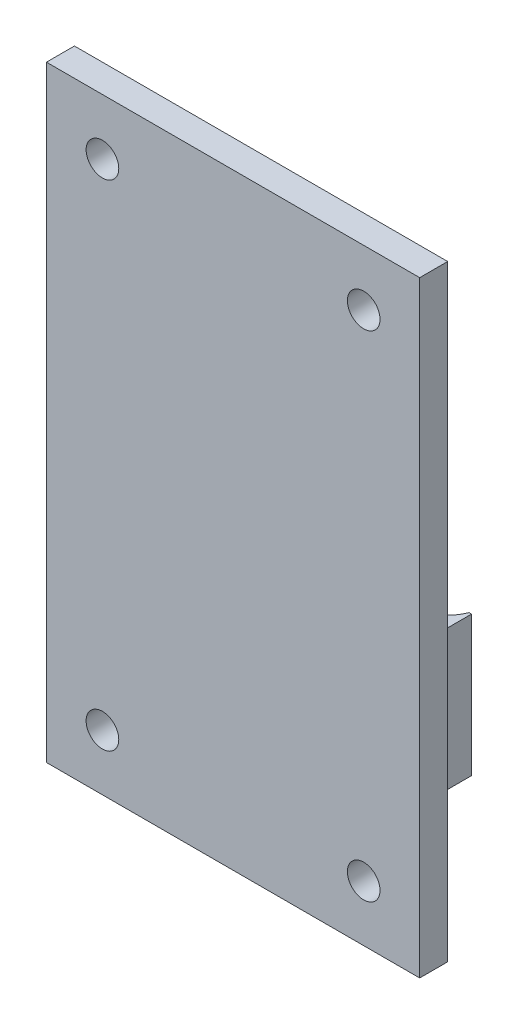
ISO-10303-21;
HEADER;
FILE_DESCRIPTION(('STEP AP214'),'2;1');
FILE_NAME('part.step','',(''),(''),'','','');
FILE_SCHEMA(('AUTOMOTIVE_DESIGN { 1 0 10303 214 1 1 1 1 }'));
ENDSEC;
DATA;
#1=APPLICATION_CONTEXT('core data for automotive mechanical design processes');
#2=APPLICATION_PROTOCOL_DEFINITION('international standard','automotive_design',2000,#1);
#3=PRODUCT_CONTEXT('',#1,'mechanical');
#4=PRODUCT('Part','Part','',(#3));
#5=PRODUCT_RELATED_PRODUCT_CATEGORY('part','',(#4));
#6=PRODUCT_DEFINITION_FORMATION('','',#4);
#7=PRODUCT_DEFINITION_CONTEXT('part definition',#1,'design');
#8=PRODUCT_DEFINITION('design','',#6,#7);
#9=PRODUCT_DEFINITION_SHAPE('','',#8);
#10=(LENGTH_UNIT() NAMED_UNIT(*) SI_UNIT(.MILLI.,.METRE.));
#11=(NAMED_UNIT(*) PLANE_ANGLE_UNIT() SI_UNIT($,.RADIAN.));
#12=(NAMED_UNIT(*) SI_UNIT($,.STERADIAN.) SOLID_ANGLE_UNIT());
#13=UNCERTAINTY_MEASURE_WITH_UNIT(LENGTH_MEASURE(1.E-05),#10,'distance_accuracy_value','');
#14=(GEOMETRIC_REPRESENTATION_CONTEXT(3) GLOBAL_UNCERTAINTY_ASSIGNED_CONTEXT((#13)) GLOBAL_UNIT_ASSIGNED_CONTEXT((#10,
#11,#12)) REPRESENTATION_CONTEXT('',''));
#15=CARTESIAN_POINT('',(0.,0.,0.));
#16=DIRECTION('',(0.,0.,1.));
#17=DIRECTION('',(1.,0.,0.));
#18=AXIS2_PLACEMENT_3D('',#15,#16,#17);
#19=CARTESIAN_POINT('',(0.,0.,3.));
#20=DIRECTION('',(0.,0.,-1.));
#21=DIRECTION('',(-1.,0.,0.));
#22=AXIS2_PLACEMENT_3D('',#19,#20,#21);
#23=PLANE('',#22);
#24=DIRECTION('',(0.,-1.,0.));
#25=VECTOR('',#24,1.);
#26=CARTESIAN_POINT('',(0.,0.,3.));
#27=LINE('',#26,#25);
#28=CARTESIAN_POINT('',(0.,65.,3.));
#29=VERTEX_POINT('',#28);
#30=CARTESIAN_POINT('',(0.,0.,3.));
#31=VERTEX_POINT('',#30);
#32=EDGE_CURVE('E181',#29,#31,#27,.T.);
#33=ORIENTED_EDGE('',*,*,#32,.T.);
#34=DIRECTION('',(1.,0.,0.));
#35=VECTOR('',#34,1.);
#36=CARTESIAN_POINT('',(0.,0.,3.));
#37=LINE('',#36,#35);
#38=CARTESIAN_POINT('',(40.,0.,3.));
#39=VERTEX_POINT('',#38);
#40=EDGE_CURVE('E87',#31,#39,#37,.T.);
#41=ORIENTED_EDGE('',*,*,#40,.T.);
#42=DIRECTION('',(0.,1.,0.));
#43=VECTOR('',#42,1.);
#44=CARTESIAN_POINT('',(40.,0.,3.));
#45=LINE('',#44,#43);
#46=CARTESIAN_POINT('',(40.,65.,3.));
#47=VERTEX_POINT('',#46);
#48=EDGE_CURVE('E184',#39,#47,#45,.T.);
#49=ORIENTED_EDGE('',*,*,#48,.T.);
#50=DIRECTION('',(-1.,0.,0.));
#51=VECTOR('',#50,1.);
#52=CARTESIAN_POINT('',(0.,65.,3.));
#53=LINE('',#52,#51);
#54=EDGE_CURVE('E59',#47,#29,#53,.T.);
#55=ORIENTED_EDGE('',*,*,#54,.T.);
#56=EDGE_LOOP('',(#33,#41,#49,#55));
#57=FACE_BOUND('',#56,.T.);
#58=CARTESIAN_POINT('',(6.,59.,3.));
#59=DIRECTION('',(0.,0.,1.));
#60=DIRECTION('',(1.,0.,0.));
#61=AXIS2_PLACEMENT_3D('',#58,#59,#60);
#62=CIRCLE('',#61,1.75);
#63=CARTESIAN_POINT('',(7.75,59.,3.));
#64=VERTEX_POINT('',#63);
#65=EDGE_CURVE('E175',#64,#64,#62,.T.);
#66=ORIENTED_EDGE('',*,*,#65,.F.);
#67=EDGE_LOOP('',(#66));
#68=FACE_BOUND('',#67,.T.);
#69=CARTESIAN_POINT('',(34.,59.,3.));
#70=DIRECTION('',(0.,0.,1.));
#71=DIRECTION('',(1.,0.,0.));
#72=AXIS2_PLACEMENT_3D('',#69,#70,#71);
#73=CIRCLE('',#72,1.75);
#74=CARTESIAN_POINT('',(35.75,59.,3.));
#75=VERTEX_POINT('',#74);
#76=EDGE_CURVE('E169',#75,#75,#73,.T.);
#77=ORIENTED_EDGE('',*,*,#76,.F.);
#78=EDGE_LOOP('',(#77));
#79=FACE_BOUND('',#78,.T.);
#80=CARTESIAN_POINT('',(6.00000000000001,6.,3.));
#81=DIRECTION('',(0.,0.,1.));
#82=DIRECTION('',(1.,0.,0.));
#83=AXIS2_PLACEMENT_3D('',#80,#81,#82);
#84=CIRCLE('',#83,1.75);
#85=CARTESIAN_POINT('',(7.75000000000001,6.,3.));
#86=VERTEX_POINT('',#85);
#87=EDGE_CURVE('E163',#86,#86,#84,.T.);
#88=ORIENTED_EDGE('',*,*,#87,.F.);
#89=EDGE_LOOP('',(#88));
#90=FACE_BOUND('',#89,.T.);
#91=CARTESIAN_POINT('',(34.,6.,3.));
#92=DIRECTION('',(0.,0.,1.));
#93=DIRECTION('',(1.,0.,0.));
#94=AXIS2_PLACEMENT_3D('',#91,#92,#93);
#95=CIRCLE('',#94,1.75);
#96=CARTESIAN_POINT('',(35.75,6.,3.));
#97=VERTEX_POINT('',#96);
#98=EDGE_CURVE('E156',#97,#97,#95,.T.);
#99=ORIENTED_EDGE('',*,*,#98,.F.);
#100=EDGE_LOOP('',(#99));
#101=FACE_BOUND('',#100,.T.);
#102=ADVANCED_FACE('F35',(#57,#68,#79,#90,#101),#23,.F.);
#103=CARTESIAN_POINT('',(0.,0.,0.));
#104=DIRECTION('',(0.,0.,-1.));
#105=DIRECTION('',(-1.,0.,0.));
#106=AXIS2_PLACEMENT_3D('',#103,#104,#105);
#107=PLANE('',#106);
#108=DIRECTION('',(0.,-1.,0.));
#109=VECTOR('',#108,1.);
#110=CARTESIAN_POINT('',(24.,15.,0.));
#111=LINE('',#110,#109);
#112=CARTESIAN_POINT('',(24.,15.,0.));
#113=VERTEX_POINT('',#112);
#114=CARTESIAN_POINT('',(24.,0.,0.));
#115=VERTEX_POINT('',#114);
#116=EDGE_CURVE('E137',#113,#115,#111,.T.);
#117=ORIENTED_EDGE('',*,*,#116,.F.);
#118=DIRECTION('',(-1.,0.,0.));
#119=VECTOR('',#118,1.);
#120=CARTESIAN_POINT('',(24.,15.,0.));
#121=LINE('',#120,#119);
#122=CARTESIAN_POINT('',(16.,15.,0.));
#123=VERTEX_POINT('',#122);
#124=EDGE_CURVE('E122',#113,#123,#121,.T.);
#125=ORIENTED_EDGE('',*,*,#124,.T.);
#126=DIRECTION('',(0.,-1.,0.));
#127=VECTOR('',#126,1.);
#128=CARTESIAN_POINT('',(16.,15.,0.));
#129=LINE('',#128,#127);
#130=CARTESIAN_POINT('',(16.,0.,0.));
#131=VERTEX_POINT('',#130);
#132=EDGE_CURVE('E147',#123,#131,#129,.T.);
#133=ORIENTED_EDGE('',*,*,#132,.T.);
#134=DIRECTION('',(1.,0.,0.));
#135=VECTOR('',#134,1.);
#136=CARTESIAN_POINT('',(0.,0.,0.));
#137=LINE('',#136,#135);
#138=CARTESIAN_POINT('',(0.,0.,0.));
#139=VERTEX_POINT('',#138);
#140=EDGE_CURVE('E190',#139,#131,#137,.T.);
#141=ORIENTED_EDGE('',*,*,#140,.F.);
#142=DIRECTION('',(0.,-1.,0.));
#143=VECTOR('',#142,1.);
#144=CARTESIAN_POINT('',(0.,0.,0.));
#145=LINE('',#144,#143);
#146=CARTESIAN_POINT('',(0.,65.,0.));
#147=VERTEX_POINT('',#146);
#148=EDGE_CURVE('E178',#147,#139,#145,.T.);
#149=ORIENTED_EDGE('',*,*,#148,.F.);
#150=DIRECTION('',(-1.,0.,0.));
#151=VECTOR('',#150,1.);
#152=CARTESIAN_POINT('',(0.,65.,0.));
#153=LINE('',#152,#151);
#154=CARTESIAN_POINT('',(40.,65.,0.));
#155=VERTEX_POINT('',#154);
#156=EDGE_CURVE('E80',#155,#147,#153,.T.);
#157=ORIENTED_EDGE('',*,*,#156,.F.);
#158=DIRECTION('',(0.,1.,0.));
#159=VECTOR('',#158,1.);
#160=CARTESIAN_POINT('',(40.,0.,0.));
#161=LINE('',#160,#159);
#162=CARTESIAN_POINT('',(40.,0.,0.));
#163=VERTEX_POINT('',#162);
#164=EDGE_CURVE('E193',#163,#155,#161,.T.);
#165=ORIENTED_EDGE('',*,*,#164,.F.);
#166=EDGE_CURVE('E146',#115,#163,#137,.T.);
#167=ORIENTED_EDGE('',*,*,#166,.F.);
#168=EDGE_LOOP('',(#117,#125,#133,#141,#149,#157,#165,#167));
#169=FACE_BOUND('',#168,.T.);
#170=CARTESIAN_POINT('',(6.00000000000001,6.,0.));
#171=DIRECTION('',(0.,0.,1.));
#172=DIRECTION('',(1.,0.,0.));
#173=AXIS2_PLACEMENT_3D('',#170,#171,#172);
#174=CIRCLE('',#173,1.75);
#175=CARTESIAN_POINT('',(7.75000000000001,6.,0.));
#176=VERTEX_POINT('',#175);
#177=EDGE_CURVE('E159',#176,#176,#174,.T.);
#178=ORIENTED_EDGE('',*,*,#177,.T.);
#179=EDGE_LOOP('',(#178));
#180=FACE_BOUND('',#179,.T.);
#181=CARTESIAN_POINT('',(6.,59.,0.));
#182=DIRECTION('',(0.,0.,1.));
#183=DIRECTION('',(1.,0.,0.));
#184=AXIS2_PLACEMENT_3D('',#181,#182,#183);
#185=CIRCLE('',#184,1.75);
#186=CARTESIAN_POINT('',(7.75,59.,0.));
#187=VERTEX_POINT('',#186);
#188=EDGE_CURVE('E172',#187,#187,#185,.T.);
#189=ORIENTED_EDGE('',*,*,#188,.T.);
#190=EDGE_LOOP('',(#189));
#191=FACE_BOUND('',#190,.T.);
#192=CARTESIAN_POINT('',(34.,59.,0.));
#193=DIRECTION('',(0.,0.,1.));
#194=DIRECTION('',(1.,0.,0.));
#195=AXIS2_PLACEMENT_3D('',#192,#193,#194);
#196=CIRCLE('',#195,1.75);
#197=CARTESIAN_POINT('',(35.75,59.,0.));
#198=VERTEX_POINT('',#197);
#199=EDGE_CURVE('E166',#198,#198,#196,.T.);
#200=ORIENTED_EDGE('',*,*,#199,.T.);
#201=EDGE_LOOP('',(#200));
#202=FACE_BOUND('',#201,.T.);
#203=CARTESIAN_POINT('',(34.,6.,0.));
#204=DIRECTION('',(0.,0.,1.));
#205=DIRECTION('',(1.,0.,0.));
#206=AXIS2_PLACEMENT_3D('',#203,#204,#205);
#207=CIRCLE('',#206,1.75);
#208=CARTESIAN_POINT('',(35.75,6.,0.));
#209=VERTEX_POINT('',#208);
#210=EDGE_CURVE('E160',#209,#209,#207,.T.);
#211=ORIENTED_EDGE('',*,*,#210,.T.);
#212=EDGE_LOOP('',(#211));
#213=FACE_BOUND('',#212,.T.);
#214=ADVANCED_FACE('F143',(#169,#180,#191,#202,#213),#107,.T.);
#215=CARTESIAN_POINT('',(0.,0.,3.));
#216=DIRECTION('',(1.,0.,0.));
#217=DIRECTION('',(0.,0.,-1.));
#218=AXIS2_PLACEMENT_3D('',#215,#216,#217);
#219=PLANE('',#218);
#220=ORIENTED_EDGE('',*,*,#148,.T.);
#221=DIRECTION('',(0.,0.,-1.));
#222=VECTOR('',#221,1.);
#223=CARTESIAN_POINT('',(0.,0.,3.));
#224=LINE('',#223,#222);
#225=EDGE_CURVE('E11',#31,#139,#224,.T.);
#226=ORIENTED_EDGE('',*,*,#225,.F.);
#227=ORIENTED_EDGE('',*,*,#32,.F.);
#228=DIRECTION('',(0.,0.,-1.));
#229=VECTOR('',#228,1.);
#230=CARTESIAN_POINT('',(0.,65.,3.));
#231=LINE('',#230,#229);
#232=EDGE_CURVE('E187',#29,#147,#231,.T.);
#233=ORIENTED_EDGE('',*,*,#232,.T.);
#234=EDGE_LOOP('',(#220,#226,#227,#233));
#235=FACE_BOUND('',#234,.T.);
#236=ADVANCED_FACE('F37',(#235),#219,.F.);
#237=CARTESIAN_POINT('',(0.,0.,3.));
#238=DIRECTION('',(0.,1.,0.));
#239=DIRECTION('',(0.,0.,1.));
#240=AXIS2_PLACEMENT_3D('',#237,#238,#239);
#241=PLANE('',#240);
#242=ORIENTED_EDGE('',*,*,#140,.T.);
#243=DIRECTION('',(0.,0.,-1.));
#244=VECTOR('',#243,1.);
#245=CARTESIAN_POINT('',(16.,0.,0.));
#246=LINE('',#245,#244);
#247=CARTESIAN_POINT('',(16.,0.,-18.5581640937435));
#248=VERTEX_POINT('',#247);
#249=EDGE_CURVE('E50',#131,#248,#246,.T.);
#250=ORIENTED_EDGE('',*,*,#249,.T.);
#251=DIRECTION('',(1.,0.,0.));
#252=VECTOR('',#251,1.);
#253=CARTESIAN_POINT('',(16.2688997307189,0.,-18.5581640937435));
#254=LINE('',#253,#252);
#255=CARTESIAN_POINT('',(16.2688997307189,0.,-18.5581640937435));
#256=VERTEX_POINT('',#255);
#257=EDGE_CURVE('E357',#248,#256,#254,.T.);
#258=ORIENTED_EDGE('',*,*,#257,.T.);
#259=CARTESIAN_POINT('',(20.,0.,-20.));
#260=DIRECTION('',(0.,1.,0.));
#261=DIRECTION('',(0.,0.,-1.));
#262=AXIS2_PLACEMENT_3D('',#259,#260,#261);
#263=CIRCLE('',#262,4.);
#264=CARTESIAN_POINT('',(23.7311002692811,0.,-18.5581640937435));
#265=VERTEX_POINT('',#264);
#266=EDGE_CURVE('E360',#256,#265,#263,.T.);
#267=ORIENTED_EDGE('',*,*,#266,.T.);
#268=DIRECTION('',(1.,0.,0.));
#269=VECTOR('',#268,1.);
#270=CARTESIAN_POINT('',(23.7311002692811,0.,-18.5581640937435));
#271=LINE('',#270,#269);
#272=CARTESIAN_POINT('',(24.,0.,-18.5581640937435));
#273=VERTEX_POINT('',#272);
#274=EDGE_CURVE('E140',#265,#273,#271,.T.);
#275=ORIENTED_EDGE('',*,*,#274,.T.);
#276=DIRECTION('',(0.,0.,1.));
#277=VECTOR('',#276,1.);
#278=CARTESIAN_POINT('',(24.,0.,0.));
#279=LINE('',#278,#277);
#280=EDGE_CURVE('E358',#273,#115,#279,.T.);
#281=ORIENTED_EDGE('',*,*,#280,.T.);
#282=ORIENTED_EDGE('',*,*,#166,.T.);
#283=DIRECTION('',(0.,0.,-1.));
#284=VECTOR('',#283,1.);
#285=CARTESIAN_POINT('',(40.,0.,3.));
#286=LINE('',#285,#284);
#287=EDGE_CURVE('E43',#39,#163,#286,.T.);
#288=ORIENTED_EDGE('',*,*,#287,.F.);
#289=ORIENTED_EDGE('',*,*,#40,.F.);
#290=ORIENTED_EDGE('',*,*,#225,.T.);
#291=EDGE_LOOP('',(#242,#250,#258,#267,#275,#281,#282,#288,#289,#290));
#292=FACE_BOUND('',#291,.T.);
#293=ADVANCED_FACE('F218',(#292),#241,.F.);
#294=CARTESIAN_POINT('',(40.,0.,3.));
#295=DIRECTION('',(-1.,0.,0.));
#296=DIRECTION('',(0.,0.,1.));
#297=AXIS2_PLACEMENT_3D('',#294,#295,#296);
#298=PLANE('',#297);
#299=ORIENTED_EDGE('',*,*,#164,.T.);
#300=DIRECTION('',(0.,0.,-1.));
#301=VECTOR('',#300,1.);
#302=CARTESIAN_POINT('',(40.,65.,3.));
#303=LINE('',#302,#301);
#304=EDGE_CURVE('E197',#47,#155,#303,.T.);
#305=ORIENTED_EDGE('',*,*,#304,.F.);
#306=ORIENTED_EDGE('',*,*,#48,.F.);
#307=ORIENTED_EDGE('',*,*,#287,.T.);
#308=EDGE_LOOP('',(#299,#305,#306,#307));
#309=FACE_BOUND('',#308,.T.);
#310=ADVANCED_FACE('F201',(#309),#298,.F.);
#311=CARTESIAN_POINT('',(0.,65.,3.));
#312=DIRECTION('',(0.,-1.,0.));
#313=DIRECTION('',(0.,0.,-1.));
#314=AXIS2_PLACEMENT_3D('',#311,#312,#313);
#315=PLANE('',#314);
#316=ORIENTED_EDGE('',*,*,#156,.T.);
#317=ORIENTED_EDGE('',*,*,#232,.F.);
#318=ORIENTED_EDGE('',*,*,#54,.F.);
#319=ORIENTED_EDGE('',*,*,#304,.T.);
#320=EDGE_LOOP('',(#316,#317,#318,#319));
#321=FACE_BOUND('',#320,.T.);
#322=ADVANCED_FACE('F207',(#321),#315,.F.);
#323=CARTESIAN_POINT('',(6.,59.,3.));
#324=DIRECTION('',(0.,0.,-1.));
#325=DIRECTION('',(-1.,0.,0.));
#326=AXIS2_PLACEMENT_3D('',#323,#324,#325);
#327=CYLINDRICAL_SURFACE('',#326,1.75);
#328=ORIENTED_EDGE('',*,*,#65,.T.);
#329=EDGE_LOOP('',(#328));
#330=FACE_BOUND('',#329,.T.);
#331=ORIENTED_EDGE('',*,*,#188,.F.);
#332=EDGE_LOOP('',(#331));
#333=FACE_BOUND('',#332,.T.);
#334=ADVANCED_FACE('F209',(#330,#333),#327,.F.);
#335=CARTESIAN_POINT('',(34.,59.,3.));
#336=DIRECTION('',(0.,0.,-1.));
#337=DIRECTION('',(-1.,0.,0.));
#338=AXIS2_PLACEMENT_3D('',#335,#336,#337);
#339=CYLINDRICAL_SURFACE('',#338,1.75);
#340=ORIENTED_EDGE('',*,*,#76,.T.);
#341=EDGE_LOOP('',(#340));
#342=FACE_BOUND('',#341,.T.);
#343=ORIENTED_EDGE('',*,*,#199,.F.);
#344=EDGE_LOOP('',(#343));
#345=FACE_BOUND('',#344,.T.);
#346=ADVANCED_FACE('F215',(#342,#345),#339,.F.);
#347=CARTESIAN_POINT('',(6.00000000000001,6.,3.));
#348=DIRECTION('',(0.,0.,-1.));
#349=DIRECTION('',(-1.,0.,0.));
#350=AXIS2_PLACEMENT_3D('',#347,#348,#349);
#351=CYLINDRICAL_SURFACE('',#350,1.75);
#352=ORIENTED_EDGE('',*,*,#87,.T.);
#353=EDGE_LOOP('',(#352));
#354=FACE_BOUND('',#353,.T.);
#355=ORIENTED_EDGE('',*,*,#177,.F.);
#356=EDGE_LOOP('',(#355));
#357=FACE_BOUND('',#356,.T.);
#358=ADVANCED_FACE('F230',(#354,#357),#351,.F.);
#359=CARTESIAN_POINT('',(34.,6.,3.));
#360=DIRECTION('',(0.,0.,-1.));
#361=DIRECTION('',(-1.,0.,0.));
#362=AXIS2_PLACEMENT_3D('',#359,#360,#361);
#363=CYLINDRICAL_SURFACE('',#362,1.75);
#364=ORIENTED_EDGE('',*,*,#98,.T.);
#365=EDGE_LOOP('',(#364));
#366=FACE_BOUND('',#365,.T.);
#367=ORIENTED_EDGE('',*,*,#210,.F.);
#368=EDGE_LOOP('',(#367));
#369=FACE_BOUND('',#368,.T.);
#370=ADVANCED_FACE('F234',(#366,#369),#363,.F.);
#371=CARTESIAN_POINT('',(24.,15.,0.));
#372=DIRECTION('',(1.,0.,0.));
#373=DIRECTION('',(0.,0.,-1.));
#374=AXIS2_PLACEMENT_3D('',#371,#372,#373);
#375=PLANE('',#374);
#376=ORIENTED_EDGE('',*,*,#280,.F.);
#377=DIRECTION('',(0.,-1.,0.));
#378=VECTOR('',#377,1.);
#379=CARTESIAN_POINT('',(24.,15.,-18.5581640937435));
#380=LINE('',#379,#378);
#381=CARTESIAN_POINT('',(24.,15.,-18.5581640937435));
#382=VERTEX_POINT('',#381);
#383=EDGE_CURVE('E139',#382,#273,#380,.T.);
#384=ORIENTED_EDGE('',*,*,#383,.F.);
#385=DIRECTION('',(0.,0.,1.));
#386=VECTOR('',#385,1.);
#387=CARTESIAN_POINT('',(24.,15.,0.));
#388=LINE('',#387,#386);
#389=EDGE_CURVE('E126',#382,#113,#388,.T.);
#390=ORIENTED_EDGE('',*,*,#389,.T.);
#391=ORIENTED_EDGE('',*,*,#116,.T.);
#392=EDGE_LOOP('',(#376,#384,#390,#391));
#393=FACE_BOUND('',#392,.T.);
#394=ADVANCED_FACE('F136',(#393),#375,.T.);
#395=CARTESIAN_POINT('',(23.7311002692811,15.,-18.5581640937435));
#396=DIRECTION('',(0.,0.,-1.));
#397=DIRECTION('',(-1.,0.,0.));
#398=AXIS2_PLACEMENT_3D('',#395,#396,#397);
#399=PLANE('',#398);
#400=ORIENTED_EDGE('',*,*,#274,.F.);
#401=DIRECTION('',(0.,-1.,0.));
#402=VECTOR('',#401,1.);
#403=CARTESIAN_POINT('',(23.7311002692811,15.,-18.5581640937435));
#404=LINE('',#403,#402);
#405=CARTESIAN_POINT('',(23.7311002692811,15.,-18.5581640937435));
#406=VERTEX_POINT('',#405);
#407=EDGE_CURVE('E368',#406,#265,#404,.T.);
#408=ORIENTED_EDGE('',*,*,#407,.F.);
#409=DIRECTION('',(1.,0.,0.));
#410=VECTOR('',#409,1.);
#411=CARTESIAN_POINT('',(23.7311002692811,15.,-18.5581640937435));
#412=LINE('',#411,#410);
#413=EDGE_CURVE('E148',#406,#382,#412,.T.);
#414=ORIENTED_EDGE('',*,*,#413,.T.);
#415=ORIENTED_EDGE('',*,*,#383,.T.);
#416=EDGE_LOOP('',(#400,#408,#414,#415));
#417=FACE_BOUND('',#416,.T.);
#418=ADVANCED_FACE('F241',(#417),#399,.T.);
#419=CARTESIAN_POINT('',(20.,15.,-20.));
#420=DIRECTION('',(0.,-1.,0.));
#421=DIRECTION('',(0.,0.,-1.));
#422=AXIS2_PLACEMENT_3D('',#419,#420,#421);
#423=CYLINDRICAL_SURFACE('',#422,4.);
#424=ORIENTED_EDGE('',*,*,#266,.F.);
#425=DIRECTION('',(0.,-1.,0.));
#426=VECTOR('',#425,1.);
#427=CARTESIAN_POINT('',(16.2688997307189,15.,-18.5581640937435));
#428=LINE('',#427,#426);
#429=CARTESIAN_POINT('',(16.2688997307189,15.,-18.5581640937435));
#430=VERTEX_POINT('',#429);
#431=EDGE_CURVE('E370',#430,#256,#428,.T.);
#432=ORIENTED_EDGE('',*,*,#431,.F.);
#433=CARTESIAN_POINT('',(20.,15.,-20.));
#434=DIRECTION('',(0.,1.,0.));
#435=DIRECTION('',(0.,0.,-1.));
#436=AXIS2_PLACEMENT_3D('',#433,#434,#435);
#437=CIRCLE('',#436,4.);
#438=EDGE_CURVE('E152',#430,#406,#437,.T.);
#439=ORIENTED_EDGE('',*,*,#438,.T.);
#440=ORIENTED_EDGE('',*,*,#407,.T.);
#441=EDGE_LOOP('',(#424,#432,#439,#440));
#442=FACE_BOUND('',#441,.T.);
#443=ADVANCED_FACE('F248',(#442),#423,.F.);
#444=CARTESIAN_POINT('',(16.2688997307189,15.,-18.5581640937435));
#445=DIRECTION('',(0.,0.,-1.));
#446=DIRECTION('',(-1.,0.,0.));
#447=AXIS2_PLACEMENT_3D('',#444,#445,#446);
#448=PLANE('',#447);
#449=ORIENTED_EDGE('',*,*,#257,.F.);
#450=DIRECTION('',(0.,-1.,0.));
#451=VECTOR('',#450,1.);
#452=CARTESIAN_POINT('',(16.,15.,-18.5581640937435));
#453=LINE('',#452,#451);
#454=CARTESIAN_POINT('',(16.,15.,-18.5581640937435));
#455=VERTEX_POINT('',#454);
#456=EDGE_CURVE('E150',#455,#248,#453,.T.);
#457=ORIENTED_EDGE('',*,*,#456,.F.);
#458=DIRECTION('',(1.,0.,0.));
#459=VECTOR('',#458,1.);
#460=CARTESIAN_POINT('',(16.2688997307189,15.,-18.5581640937435));
#461=LINE('',#460,#459);
#462=EDGE_CURVE('E373',#455,#430,#461,.T.);
#463=ORIENTED_EDGE('',*,*,#462,.T.);
#464=ORIENTED_EDGE('',*,*,#431,.T.);
#465=EDGE_LOOP('',(#449,#457,#463,#464));
#466=FACE_BOUND('',#465,.T.);
#467=ADVANCED_FACE('F245',(#466),#448,.T.);
#468=CARTESIAN_POINT('',(16.,15.,0.));
#469=DIRECTION('',(-1.,0.,0.));
#470=DIRECTION('',(0.,0.,1.));
#471=AXIS2_PLACEMENT_3D('',#468,#469,#470);
#472=PLANE('',#471);
#473=ORIENTED_EDGE('',*,*,#249,.F.);
#474=ORIENTED_EDGE('',*,*,#132,.F.);
#475=DIRECTION('',(0.,0.,-1.));
#476=VECTOR('',#475,1.);
#477=CARTESIAN_POINT('',(16.,15.,0.));
#478=LINE('',#477,#476);
#479=EDGE_CURVE('E130',#123,#455,#478,.T.);
#480=ORIENTED_EDGE('',*,*,#479,.T.);
#481=ORIENTED_EDGE('',*,*,#456,.T.);
#482=EDGE_LOOP('',(#473,#474,#480,#481));
#483=FACE_BOUND('',#482,.T.);
#484=ADVANCED_FACE('F242',(#483),#472,.T.);
#485=CARTESIAN_POINT('',(20.,15.,-20.));
#486=DIRECTION('',(0.,-1.,0.));
#487=DIRECTION('',(0.,0.,-1.));
#488=AXIS2_PLACEMENT_3D('',#485,#486,#487);
#489=PLANE('',#488);
#490=ORIENTED_EDGE('',*,*,#389,.F.);
#491=ORIENTED_EDGE('',*,*,#413,.F.);
#492=ORIENTED_EDGE('',*,*,#438,.F.);
#493=ORIENTED_EDGE('',*,*,#462,.F.);
#494=ORIENTED_EDGE('',*,*,#479,.F.);
#495=ORIENTED_EDGE('',*,*,#124,.F.);
#496=EDGE_LOOP('',(#490,#491,#492,#493,#494,#495));
#497=FACE_BOUND('',#496,.T.);
#498=ADVANCED_FACE('F124',(#497),#489,.F.);
#499=CLOSED_SHELL('',(#102,#214,#236,#293,#310,#322,#334,#346,#358,#370,#394,#418,#443,#467,
#484,#498));
#500=MANIFOLD_SOLID_BREP('B2',#499);
#501=ADVANCED_BREP_SHAPE_REPRESENTATION('',(#18,#500),#14);
#502=SHAPE_DEFINITION_REPRESENTATION(#9,#501);
ENDSEC;
END-ISO-10303-21;
